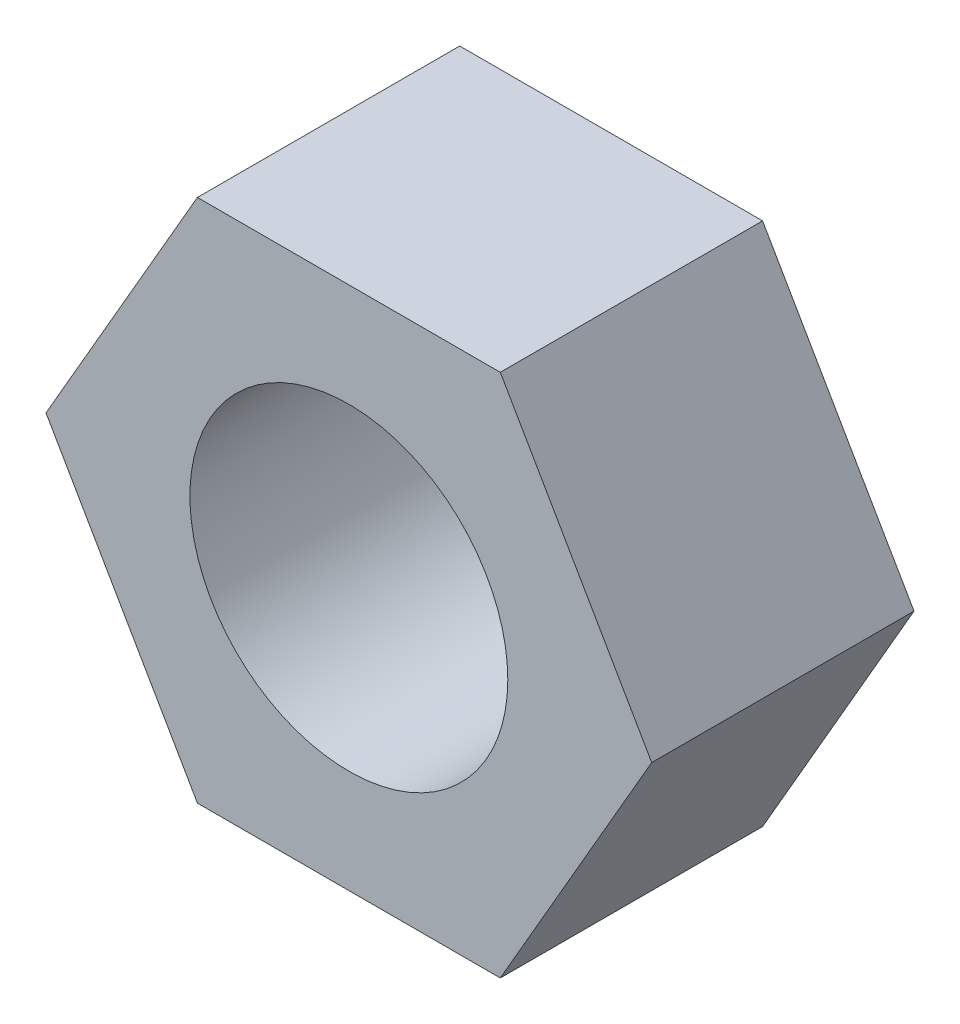
ISO-10303-21;
HEADER;
FILE_DESCRIPTION(('STEP AP214'),'2;1');
FILE_NAME('part.step','',(''),(''),'','','');
FILE_SCHEMA(('AUTOMOTIVE_DESIGN { 1 0 10303 214 1 1 1 1 }'));
ENDSEC;
DATA;
#1=APPLICATION_CONTEXT('core data for automotive mechanical design processes');
#2=APPLICATION_PROTOCOL_DEFINITION('international standard','automotive_design',2000,#1);
#3=PRODUCT_CONTEXT('',#1,'mechanical');
#4=PRODUCT('Part','Part','',(#3));
#5=PRODUCT_RELATED_PRODUCT_CATEGORY('part','',(#4));
#6=PRODUCT_DEFINITION_FORMATION('','',#4);
#7=PRODUCT_DEFINITION_CONTEXT('part definition',#1,'design');
#8=PRODUCT_DEFINITION('design','',#6,#7);
#9=PRODUCT_DEFINITION_SHAPE('','',#8);
#10=(LENGTH_UNIT() NAMED_UNIT(*) SI_UNIT(.MILLI.,.METRE.));
#11=(NAMED_UNIT(*) PLANE_ANGLE_UNIT() SI_UNIT($,.RADIAN.));
#12=(NAMED_UNIT(*) SI_UNIT($,.STERADIAN.) SOLID_ANGLE_UNIT());
#13=UNCERTAINTY_MEASURE_WITH_UNIT(LENGTH_MEASURE(1.E-05),#10,'distance_accuracy_value','');
#14=(GEOMETRIC_REPRESENTATION_CONTEXT(3) GLOBAL_UNCERTAINTY_ASSIGNED_CONTEXT((#13)) GLOBAL_UNIT_ASSIGNED_CONTEXT((#10,
#11,#12)) REPRESENTATION_CONTEXT('',''));
#15=CARTESIAN_POINT('',(0.,0.,0.));
#16=DIRECTION('',(0.,0.,1.));
#17=DIRECTION('',(1.,0.,0.));
#18=AXIS2_PLACEMENT_3D('',#15,#16,#17);
#19=CARTESIAN_POINT('',(0.,0.,5.));
#20=DIRECTION('',(0.,0.,1.));
#21=DIRECTION('',(1.,0.,0.));
#22=AXIS2_PLACEMENT_3D('',#19,#20,#21);
#23=PLANE('',#22);
#24=DIRECTION('',(0.5,0.866025403784439,0.));
#25=VECTOR('',#24,1.);
#26=CARTESIAN_POINT('',(2.88675134594813,-5.,5.));
#27=LINE('',#26,#25);
#28=CARTESIAN_POINT('',(2.88675134594813,-5.,5.));
#29=VERTEX_POINT('',#28);
#30=CARTESIAN_POINT('',(5.77350269189626,0.,5.));
#31=VERTEX_POINT('',#30);
#32=EDGE_CURVE('E132',#29,#31,#27,.T.);
#33=ORIENTED_EDGE('',*,*,#32,.T.);
#34=DIRECTION('',(-0.5,0.866025403784439,0.));
#35=VECTOR('',#34,1.);
#36=CARTESIAN_POINT('',(5.77350269189626,0.,5.));
#37=LINE('',#36,#35);
#38=CARTESIAN_POINT('',(2.88675134594813,5.,5.));
#39=VERTEX_POINT('',#38);
#40=EDGE_CURVE('E91',#31,#39,#37,.T.);
#41=ORIENTED_EDGE('',*,*,#40,.T.);
#42=DIRECTION('',(-1.,0.,0.));
#43=VECTOR('',#42,1.);
#44=CARTESIAN_POINT('',(2.88675134594813,5.,5.));
#45=LINE('',#44,#43);
#46=CARTESIAN_POINT('',(-2.88675134594813,5.,5.));
#47=VERTEX_POINT('',#46);
#48=EDGE_CURVE('E106',#39,#47,#45,.T.);
#49=ORIENTED_EDGE('',*,*,#48,.T.);
#50=DIRECTION('',(-0.5,-0.866025403784439,0.));
#51=VECTOR('',#50,1.);
#52=CARTESIAN_POINT('',(-2.88675134594813,5.,5.));
#53=LINE('',#52,#51);
#54=CARTESIAN_POINT('',(-5.77350269189626,0.,5.));
#55=VERTEX_POINT('',#54);
#56=EDGE_CURVE('E99',#47,#55,#53,.T.);
#57=ORIENTED_EDGE('',*,*,#56,.T.);
#58=DIRECTION('',(0.5,-0.866025403784439,0.));
#59=VECTOR('',#58,1.);
#60=CARTESIAN_POINT('',(-5.77350269189626,0.,5.));
#61=LINE('',#60,#59);
#62=CARTESIAN_POINT('',(-2.88675134594813,-5.,5.));
#63=VERTEX_POINT('',#62);
#64=EDGE_CURVE('E102',#55,#63,#61,.T.);
#65=ORIENTED_EDGE('',*,*,#64,.T.);
#66=DIRECTION('',(1.,0.,0.));
#67=VECTOR('',#66,1.);
#68=CARTESIAN_POINT('',(-2.88675134594813,-5.,5.));
#69=LINE('',#68,#67);
#70=EDGE_CURVE('E57',#63,#29,#69,.T.);
#71=ORIENTED_EDGE('',*,*,#70,.T.);
#72=EDGE_LOOP('',(#33,#41,#49,#57,#65,#71));
#73=FACE_BOUND('',#72,.T.);
#74=CARTESIAN_POINT('',(0.,0.,5.));
#75=DIRECTION('',(0.,0.,1.));
#76=DIRECTION('',(1.,0.,0.));
#77=AXIS2_PLACEMENT_3D('',#74,#75,#76);
#78=CIRCLE('',#77,3.03);
#79=CARTESIAN_POINT('',(3.03,0.,5.));
#80=VERTEX_POINT('',#79);
#81=EDGE_CURVE('E126',#80,#80,#78,.T.);
#82=ORIENTED_EDGE('',*,*,#81,.F.);
#83=EDGE_LOOP('',(#82));
#84=FACE_BOUND('',#83,.T.);
#85=ADVANCED_FACE('F39',(#73,#84),#23,.T.);
#86=CARTESIAN_POINT('',(0.,0.,0.));
#87=DIRECTION('',(0.,0.,1.));
#88=DIRECTION('',(1.,0.,0.));
#89=AXIS2_PLACEMENT_3D('',#86,#87,#88);
#90=PLANE('',#89);
#91=DIRECTION('',(0.5,0.866025403784439,0.));
#92=VECTOR('',#91,1.);
#93=CARTESIAN_POINT('',(2.88675134594813,-5.,0.));
#94=LINE('',#93,#92);
#95=CARTESIAN_POINT('',(2.88675134594813,-5.,0.));
#96=VERTEX_POINT('',#95);
#97=CARTESIAN_POINT('',(5.77350269189626,0.,0.));
#98=VERTEX_POINT('',#97);
#99=EDGE_CURVE('E121',#96,#98,#94,.T.);
#100=ORIENTED_EDGE('',*,*,#99,.F.);
#101=DIRECTION('',(1.,0.,0.));
#102=VECTOR('',#101,1.);
#103=CARTESIAN_POINT('',(-2.88675134594813,-5.,0.));
#104=LINE('',#103,#102);
#105=CARTESIAN_POINT('',(-2.88675134594813,-5.,0.));
#106=VERTEX_POINT('',#105);
#107=EDGE_CURVE('E83',#106,#96,#104,.T.);
#108=ORIENTED_EDGE('',*,*,#107,.F.);
#109=DIRECTION('',(0.5,-0.866025403784439,0.));
#110=VECTOR('',#109,1.);
#111=CARTESIAN_POINT('',(-5.77350269189626,0.,0.));
#112=LINE('',#111,#110);
#113=CARTESIAN_POINT('',(-5.77350269189626,0.,0.));
#114=VERTEX_POINT('',#113);
#115=EDGE_CURVE('E79',#114,#106,#112,.T.);
#116=ORIENTED_EDGE('',*,*,#115,.F.);
#117=DIRECTION('',(-0.5,-0.866025403784439,0.));
#118=VECTOR('',#117,1.);
#119=CARTESIAN_POINT('',(-2.88675134594813,5.,0.));
#120=LINE('',#119,#118);
#121=CARTESIAN_POINT('',(-2.88675134594813,5.,0.));
#122=VERTEX_POINT('',#121);
#123=EDGE_CURVE('E111',#122,#114,#120,.T.);
#124=ORIENTED_EDGE('',*,*,#123,.F.);
#125=DIRECTION('',(-1.,0.,0.));
#126=VECTOR('',#125,1.);
#127=CARTESIAN_POINT('',(2.88675134594813,5.,0.));
#128=LINE('',#127,#126);
#129=CARTESIAN_POINT('',(2.88675134594813,5.,0.));
#130=VERTEX_POINT('',#129);
#131=EDGE_CURVE('E128',#130,#122,#128,.T.);
#132=ORIENTED_EDGE('',*,*,#131,.F.);
#133=DIRECTION('',(-0.5,0.866025403784439,0.));
#134=VECTOR('',#133,1.);
#135=CARTESIAN_POINT('',(5.77350269189626,0.,0.));
#136=LINE('',#135,#134);
#137=EDGE_CURVE('E130',#98,#130,#136,.T.);
#138=ORIENTED_EDGE('',*,*,#137,.F.);
#139=EDGE_LOOP('',(#100,#108,#116,#124,#132,#138));
#140=FACE_BOUND('',#139,.T.);
#141=CARTESIAN_POINT('',(0.,0.,0.));
#142=DIRECTION('',(0.,0.,1.));
#143=DIRECTION('',(1.,0.,0.));
#144=AXIS2_PLACEMENT_3D('',#141,#142,#143);
#145=CIRCLE('',#144,3.03);
#146=CARTESIAN_POINT('',(3.03,0.,0.));
#147=VERTEX_POINT('',#146);
#148=EDGE_CURVE('E226',#147,#147,#145,.T.);
#149=ORIENTED_EDGE('',*,*,#148,.T.);
#150=EDGE_LOOP('',(#149));
#151=FACE_BOUND('',#150,.T.);
#152=ADVANCED_FACE('F145',(#140,#151),#90,.F.);
#153=CARTESIAN_POINT('',(2.88675134594813,-5.,5.));
#154=DIRECTION('',(-0.866025403784439,0.5,0.));
#155=DIRECTION('',(-0.5,-0.866025403784439,0.));
#156=AXIS2_PLACEMENT_3D('',#153,#154,#155);
#157=PLANE('',#156);
#158=ORIENTED_EDGE('',*,*,#99,.T.);
#159=DIRECTION('',(0.,0.,-1.));
#160=VECTOR('',#159,1.);
#161=CARTESIAN_POINT('',(5.77350269189626,0.,5.));
#162=LINE('',#161,#160);
#163=EDGE_CURVE('E11',#31,#98,#162,.T.);
#164=ORIENTED_EDGE('',*,*,#163,.F.);
#165=ORIENTED_EDGE('',*,*,#32,.F.);
#166=DIRECTION('',(0.,0.,-1.));
#167=VECTOR('',#166,1.);
#168=CARTESIAN_POINT('',(2.88675134594813,-5.,5.));
#169=LINE('',#168,#167);
#170=EDGE_CURVE('E117',#29,#96,#169,.T.);
#171=ORIENTED_EDGE('',*,*,#170,.T.);
#172=EDGE_LOOP('',(#158,#164,#165,#171));
#173=FACE_BOUND('',#172,.T.);
#174=ADVANCED_FACE('F41',(#173),#157,.F.);
#175=CARTESIAN_POINT('',(5.77350269189626,0.,5.));
#176=DIRECTION('',(-0.866025403784439,-0.5,0.));
#177=DIRECTION('',(0.5,-0.866025403784439,0.));
#178=AXIS2_PLACEMENT_3D('',#175,#176,#177);
#179=PLANE('',#178);
#180=ORIENTED_EDGE('',*,*,#137,.T.);
#181=DIRECTION('',(0.,0.,-1.));
#182=VECTOR('',#181,1.);
#183=CARTESIAN_POINT('',(2.88675134594813,5.,5.));
#184=LINE('',#183,#182);
#185=EDGE_CURVE('E48',#39,#130,#184,.T.);
#186=ORIENTED_EDGE('',*,*,#185,.F.);
#187=ORIENTED_EDGE('',*,*,#40,.F.);
#188=ORIENTED_EDGE('',*,*,#163,.T.);
#189=EDGE_LOOP('',(#180,#186,#187,#188));
#190=FACE_BOUND('',#189,.T.);
#191=ADVANCED_FACE('F166',(#190),#179,.F.);
#192=CARTESIAN_POINT('',(2.88675134594813,5.,5.));
#193=DIRECTION('',(0.,-1.,0.));
#194=DIRECTION('',(1.,0.,0.));
#195=AXIS2_PLACEMENT_3D('',#192,#193,#194);
#196=PLANE('',#195);
#197=ORIENTED_EDGE('',*,*,#131,.T.);
#198=DIRECTION('',(0.,0.,-1.));
#199=VECTOR('',#198,1.);
#200=CARTESIAN_POINT('',(-2.88675134594813,5.,5.));
#201=LINE('',#200,#199);
#202=EDGE_CURVE('E113',#47,#122,#201,.T.);
#203=ORIENTED_EDGE('',*,*,#202,.F.);
#204=ORIENTED_EDGE('',*,*,#48,.F.);
#205=ORIENTED_EDGE('',*,*,#185,.T.);
#206=EDGE_LOOP('',(#197,#203,#204,#205));
#207=FACE_BOUND('',#206,.T.);
#208=ADVANCED_FACE('F143',(#207),#196,.F.);
#209=CARTESIAN_POINT('',(-2.88675134594813,5.,5.));
#210=DIRECTION('',(0.866025403784439,-0.5,0.));
#211=DIRECTION('',(0.5,0.866025403784439,0.));
#212=AXIS2_PLACEMENT_3D('',#209,#210,#211);
#213=PLANE('',#212);
#214=ORIENTED_EDGE('',*,*,#123,.T.);
#215=DIRECTION('',(0.,0.,-1.));
#216=VECTOR('',#215,1.);
#217=CARTESIAN_POINT('',(-5.77350269189626,0.,5.));
#218=LINE('',#217,#216);
#219=EDGE_CURVE('E112',#55,#114,#218,.T.);
#220=ORIENTED_EDGE('',*,*,#219,.F.);
#221=ORIENTED_EDGE('',*,*,#56,.F.);
#222=ORIENTED_EDGE('',*,*,#202,.T.);
#223=EDGE_LOOP('',(#214,#220,#221,#222));
#224=FACE_BOUND('',#223,.T.);
#225=ADVANCED_FACE('F115',(#224),#213,.F.);
#226=CARTESIAN_POINT('',(-5.77350269189626,0.,5.));
#227=DIRECTION('',(0.866025403784439,0.5,0.));
#228=DIRECTION('',(-0.5,0.866025403784439,0.));
#229=AXIS2_PLACEMENT_3D('',#226,#227,#228);
#230=PLANE('',#229);
#231=ORIENTED_EDGE('',*,*,#115,.T.);
#232=DIRECTION('',(0.,0.,-1.));
#233=VECTOR('',#232,1.);
#234=CARTESIAN_POINT('',(-2.88675134594813,-5.,5.));
#235=LINE('',#234,#233);
#236=EDGE_CURVE('E118',#63,#106,#235,.T.);
#237=ORIENTED_EDGE('',*,*,#236,.F.);
#238=ORIENTED_EDGE('',*,*,#64,.F.);
#239=ORIENTED_EDGE('',*,*,#219,.T.);
#240=EDGE_LOOP('',(#231,#237,#238,#239));
#241=FACE_BOUND('',#240,.T.);
#242=ADVANCED_FACE('F116',(#241),#230,.F.);
#243=CARTESIAN_POINT('',(-2.88675134594813,-5.,5.));
#244=DIRECTION('',(0.,1.,0.));
#245=DIRECTION('',(-1.,0.,0.));
#246=AXIS2_PLACEMENT_3D('',#243,#244,#245);
#247=PLANE('',#246);
#248=ORIENTED_EDGE('',*,*,#107,.T.);
#249=ORIENTED_EDGE('',*,*,#170,.F.);
#250=ORIENTED_EDGE('',*,*,#70,.F.);
#251=ORIENTED_EDGE('',*,*,#236,.T.);
#252=EDGE_LOOP('',(#248,#249,#250,#251));
#253=FACE_BOUND('',#252,.T.);
#254=ADVANCED_FACE('F149',(#253),#247,.F.);
#255=CARTESIAN_POINT('',(0.,0.,5.));
#256=DIRECTION('',(0.,0.,-1.));
#257=DIRECTION('',(-1.,0.,0.));
#258=AXIS2_PLACEMENT_3D('',#255,#256,#257);
#259=CYLINDRICAL_SURFACE('',#258,3.03);
#260=ORIENTED_EDGE('',*,*,#81,.T.);
#261=EDGE_LOOP('',(#260));
#262=FACE_BOUND('',#261,.T.);
#263=ORIENTED_EDGE('',*,*,#148,.F.);
#264=EDGE_LOOP('',(#263));
#265=FACE_BOUND('',#264,.T.);
#266=ADVANCED_FACE('F151',(#262,#265),#259,.F.);
#267=CLOSED_SHELL('',(#85,#152,#174,#191,#208,#225,#242,#254,#266));
#268=MANIFOLD_SOLID_BREP('B2',#267);
#269=ADVANCED_BREP_SHAPE_REPRESENTATION('',(#18,#268),#14);
#270=SHAPE_DEFINITION_REPRESENTATION(#9,#269);
ENDSEC;
END-ISO-10303-21;
